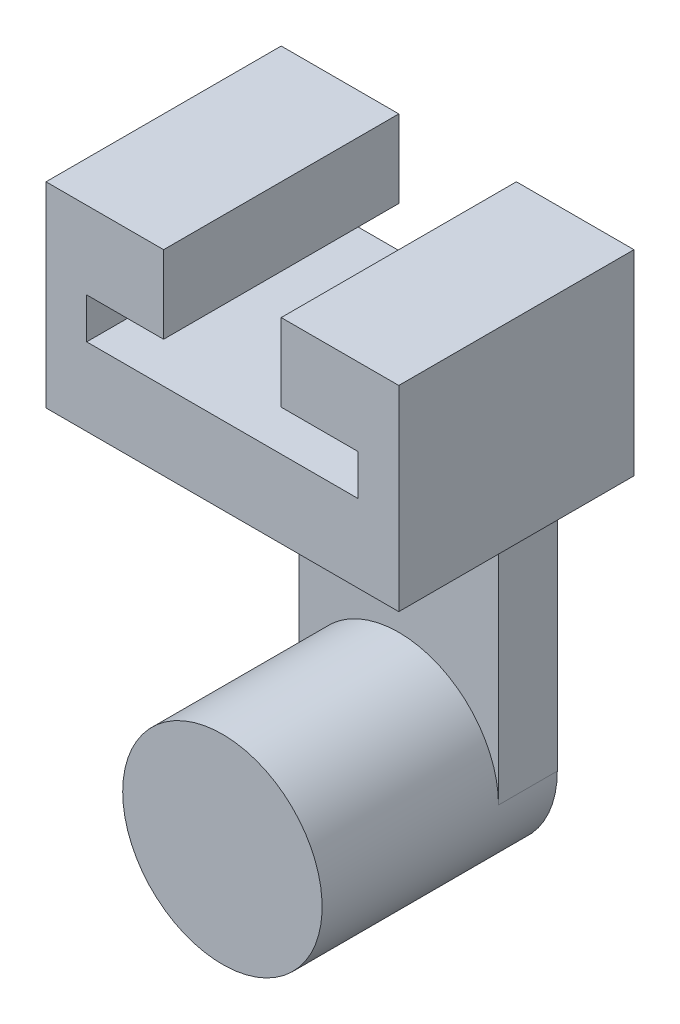
ISO-10303-21;
HEADER;
FILE_DESCRIPTION(('STEP AP214'),'2;1');
FILE_NAME('part.step','',(''),(''),'','','');
FILE_SCHEMA(('AUTOMOTIVE_DESIGN { 1 0 10303 214 1 1 1 1 }'));
ENDSEC;
DATA;
#1=APPLICATION_CONTEXT('core data for automotive mechanical design processes');
#2=APPLICATION_PROTOCOL_DEFINITION('international standard','automotive_design',2000,#1);
#3=PRODUCT_CONTEXT('',#1,'mechanical');
#4=PRODUCT('Part','Part','',(#3));
#5=PRODUCT_RELATED_PRODUCT_CATEGORY('part','',(#4));
#6=PRODUCT_DEFINITION_FORMATION('','',#4);
#7=PRODUCT_DEFINITION_CONTEXT('part definition',#1,'design');
#8=PRODUCT_DEFINITION('design','',#6,#7);
#9=PRODUCT_DEFINITION_SHAPE('','',#8);
#10=(LENGTH_UNIT() NAMED_UNIT(*) SI_UNIT(.MILLI.,.METRE.));
#11=(NAMED_UNIT(*) PLANE_ANGLE_UNIT() SI_UNIT($,.RADIAN.));
#12=(NAMED_UNIT(*) SI_UNIT($,.STERADIAN.) SOLID_ANGLE_UNIT());
#13=UNCERTAINTY_MEASURE_WITH_UNIT(LENGTH_MEASURE(1.E-05),#10,'distance_accuracy_value','');
#14=(GEOMETRIC_REPRESENTATION_CONTEXT(3) GLOBAL_UNCERTAINTY_ASSIGNED_CONTEXT((#13)) GLOBAL_UNIT_ASSIGNED_CONTEXT((#10,
#11,#12)) REPRESENTATION_CONTEXT('',''));
#15=CARTESIAN_POINT('',(0.,0.,0.));
#16=DIRECTION('',(0.,0.,1.));
#17=DIRECTION('',(1.,0.,0.));
#18=AXIS2_PLACEMENT_3D('',#15,#16,#17);
#19=CARTESIAN_POINT('',(-8.28040000000001,0.,6.35));
#20=DIRECTION('',(0.,1.,0.));
#21=DIRECTION('',(0.,0.,1.));
#22=AXIS2_PLACEMENT_3D('',#19,#20,#21);
#23=PLANE('',#22);
#24=DIRECTION('',(1.,0.,0.));
#25=VECTOR('',#24,1.);
#26=CARTESIAN_POINT('',(-8.28040000000001,0.,0.));
#27=LINE('',#26,#25);
#28=CARTESIAN_POINT('',(-29.8196,0.,0.));
#29=VERTEX_POINT('',#28);
#30=CARTESIAN_POINT('',(-8.28040000000001,0.,0.));
#31=VERTEX_POINT('',#30);
#32=EDGE_CURVE('E107',#29,#31,#27,.T.);
#33=ORIENTED_EDGE('',*,*,#32,.F.);
#34=DIRECTION('',(0.,0.,-1.));
#35=VECTOR('',#34,1.);
#36=CARTESIAN_POINT('',(-29.8196,0.,6.35));
#37=LINE('',#36,#35);
#38=CARTESIAN_POINT('',(-29.8196,0.,6.35));
#39=VERTEX_POINT('',#38);
#40=EDGE_CURVE('E12',#39,#29,#37,.T.);
#41=ORIENTED_EDGE('',*,*,#40,.F.);
#42=DIRECTION('',(1.,0.,0.));
#43=VECTOR('',#42,1.);
#44=CARTESIAN_POINT('',(-8.28040000000001,0.,6.35));
#45=LINE('',#44,#43);
#46=CARTESIAN_POINT('',(-8.28040000000001,0.,6.35));
#47=VERTEX_POINT('',#46);
#48=EDGE_CURVE('E97',#39,#47,#45,.T.);
#49=ORIENTED_EDGE('',*,*,#48,.T.);
#50=DIRECTION('',(0.,0.,-1.));
#51=VECTOR('',#50,1.);
#52=CARTESIAN_POINT('',(-8.28040000000001,0.,6.35));
#53=LINE('',#52,#51);
#54=EDGE_CURVE('E51',#47,#31,#53,.T.);
#55=ORIENTED_EDGE('',*,*,#54,.T.);
#56=EDGE_LOOP('',(#33,#41,#49,#55));
#57=FACE_BOUND('',#56,.T.);
#58=ADVANCED_FACE('F48',(#57),#23,.T.);
#59=CARTESIAN_POINT('',(-29.8196,0.,6.35));
#60=DIRECTION('',(-1.,0.,0.));
#61=DIRECTION('',(0.,-1.,0.));
#62=AXIS2_PLACEMENT_3D('',#59,#60,#61);
#63=PLANE('',#62);
#64=DIRECTION('',(0.,1.,0.));
#65=VECTOR('',#64,1.);
#66=CARTESIAN_POINT('',(-29.8196,0.,0.));
#67=LINE('',#66,#65);
#68=CARTESIAN_POINT('',(-29.8196,-31.75,0.));
#69=VERTEX_POINT('',#68);
#70=EDGE_CURVE('E85',#69,#29,#67,.T.);
#71=ORIENTED_EDGE('',*,*,#70,.F.);
#72=DIRECTION('',(0.,0.,-1.));
#73=VECTOR('',#72,1.);
#74=CARTESIAN_POINT('',(-29.8196,-31.75,6.35));
#75=LINE('',#74,#73);
#76=CARTESIAN_POINT('',(-29.8196,-31.75,6.35));
#77=VERTEX_POINT('',#76);
#78=EDGE_CURVE('E60',#77,#69,#75,.T.);
#79=ORIENTED_EDGE('',*,*,#78,.F.);
#80=DIRECTION('',(0.,1.,0.));
#81=VECTOR('',#80,1.);
#82=CARTESIAN_POINT('',(-29.8196,0.,6.35));
#83=LINE('',#82,#81);
#84=EDGE_CURVE('E94',#77,#39,#83,.T.);
#85=ORIENTED_EDGE('',*,*,#84,.T.);
#86=ORIENTED_EDGE('',*,*,#40,.T.);
#87=EDGE_LOOP('',(#71,#79,#85,#86));
#88=FACE_BOUND('',#87,.T.);
#89=ADVANCED_FACE('F99',(#88),#63,.T.);
#90=CARTESIAN_POINT('',(-8.28040000000001,0.,6.35));
#91=DIRECTION('',(1.,0.,0.));
#92=DIRECTION('',(0.,1.,0.));
#93=AXIS2_PLACEMENT_3D('',#90,#91,#92);
#94=PLANE('',#93);
#95=DIRECTION('',(0.,-1.,0.));
#96=VECTOR('',#95,1.);
#97=CARTESIAN_POINT('',(-8.28040000000001,0.,0.));
#98=LINE('',#97,#96);
#99=CARTESIAN_POINT('',(-8.2804,-31.75,0.));
#100=VERTEX_POINT('',#99);
#101=EDGE_CURVE('E113',#31,#100,#98,.T.);
#102=ORIENTED_EDGE('',*,*,#101,.F.);
#103=ORIENTED_EDGE('',*,*,#54,.F.);
#104=DIRECTION('',(0.,-1.,0.));
#105=VECTOR('',#104,1.);
#106=CARTESIAN_POINT('',(-8.28040000000001,0.,6.35));
#107=LINE('',#106,#105);
#108=CARTESIAN_POINT('',(-8.2804,-31.75,6.35));
#109=VERTEX_POINT('',#108);
#110=EDGE_CURVE('E96',#47,#109,#107,.T.);
#111=ORIENTED_EDGE('',*,*,#110,.T.);
#112=DIRECTION('',(0.,0.,-1.));
#113=VECTOR('',#112,1.);
#114=CARTESIAN_POINT('',(-8.2804,-31.75,6.35));
#115=LINE('',#114,#113);
#116=EDGE_CURVE('E104',#109,#100,#115,.T.);
#117=ORIENTED_EDGE('',*,*,#116,.T.);
#118=EDGE_LOOP('',(#102,#103,#111,#117));
#119=FACE_BOUND('',#118,.T.);
#120=ADVANCED_FACE('F121',(#119),#94,.T.);
#121=CARTESIAN_POINT('',(0.,0.,6.35));
#122=DIRECTION('',(0.,0.,1.));
#123=DIRECTION('',(1.,0.,0.));
#124=AXIS2_PLACEMENT_3D('',#121,#122,#123);
#125=PLANE('',#124);
#126=CARTESIAN_POINT('',(-19.05,-31.75,6.35));
#127=DIRECTION('',(0.,0.,1.));
#128=DIRECTION('',(1.,0.,0.));
#129=AXIS2_PLACEMENT_3D('',#126,#127,#128);
#130=CIRCLE('',#129,10.7696);
#131=EDGE_CURVE('E98',#109,#77,#130,.T.);
#132=ORIENTED_EDGE('',*,*,#131,.F.);
#133=ORIENTED_EDGE('',*,*,#110,.F.);
#134=ORIENTED_EDGE('',*,*,#48,.F.);
#135=ORIENTED_EDGE('',*,*,#84,.F.);
#136=EDGE_LOOP('',(#132,#133,#134,#135));
#137=FACE_BOUND('',#136,.T.);
#138=ADVANCED_FACE('F91',(#137),#125,.T.);
#139=CARTESIAN_POINT('',(0.,0.,0.));
#140=DIRECTION('',(0.,0.,1.));
#141=DIRECTION('',(1.,0.,0.));
#142=AXIS2_PLACEMENT_3D('',#139,#140,#141);
#143=PLANE('',#142);
#144=ORIENTED_EDGE('',*,*,#101,.T.);
#145=CARTESIAN_POINT('',(-19.05,-31.75,0.));
#146=DIRECTION('',(0.,0.,-1.));
#147=DIRECTION('',(-1.,0.,0.));
#148=AXIS2_PLACEMENT_3D('',#145,#146,#147);
#149=CIRCLE('',#148,10.7696);
#150=EDGE_CURVE('E116',#100,#69,#149,.T.);
#151=ORIENTED_EDGE('',*,*,#150,.T.);
#152=ORIENTED_EDGE('',*,*,#70,.T.);
#153=ORIENTED_EDGE('',*,*,#32,.T.);
#154=EDGE_LOOP('',(#144,#151,#152,#153));
#155=FACE_BOUND('',#154,.T.);
#156=ADVANCED_FACE('F127',(#155),#143,.F.);
#157=CARTESIAN_POINT('',(-19.05,-31.75,25.4));
#158=DIRECTION('',(0.,0.,-1.));
#159=DIRECTION('',(-1.,0.,0.));
#160=AXIS2_PLACEMENT_3D('',#157,#158,#159);
#161=CYLINDRICAL_SURFACE('',#160,10.7696);
#162=ORIENTED_EDGE('',*,*,#131,.T.);
#163=ORIENTED_EDGE('',*,*,#78,.T.);
#164=ORIENTED_EDGE('',*,*,#150,.F.);
#165=ORIENTED_EDGE('',*,*,#116,.F.);
#166=EDGE_LOOP('',(#162,#163,#164,#165));
#167=FACE_BOUND('',#166,.T.);
#168=CARTESIAN_POINT('',(-19.05,-31.75,25.4));
#169=DIRECTION('',(0.,0.,-1.));
#170=DIRECTION('',(-1.,0.,0.));
#171=AXIS2_PLACEMENT_3D('',#168,#169,#170);
#172=CIRCLE('',#171,10.7696);
#173=CARTESIAN_POINT('',(-29.8196,-31.75,25.4));
#174=VERTEX_POINT('',#173);
#175=EDGE_CURVE('E109',#174,#174,#172,.T.);
#176=ORIENTED_EDGE('',*,*,#175,.T.);
#177=EDGE_LOOP('',(#176));
#178=FACE_BOUND('',#177,.T.);
#179=ADVANCED_FACE('F110',(#167,#178),#161,.T.);
#180=CARTESIAN_POINT('',(-19.05,-31.75,25.4));
#181=DIRECTION('',(0.,0.,-1.));
#182=DIRECTION('',(-1.,0.,0.));
#183=AXIS2_PLACEMENT_3D('',#180,#181,#182);
#184=PLANE('',#183);
#185=ORIENTED_EDGE('',*,*,#175,.F.);
#186=EDGE_LOOP('',(#185));
#187=FACE_BOUND('',#186,.T.);
#188=ADVANCED_FACE('F132',(#187),#184,.F.);
#189=CLOSED_SHELL('',(#58,#89,#120,#138,#156,#179,#188));
#190=MANIFOLD_SOLID_BREP('B2',#189);
#191=CARTESIAN_POINT('',(0.,8.382,25.4));
#192=DIRECTION('',(0.,-1.,0.));
#193=DIRECTION('',(1.,0.,0.));
#194=AXIS2_PLACEMENT_3D('',#191,#192,#193);
#195=PLANE('',#194);
#196=DIRECTION('',(-1.,0.,0.));
#197=VECTOR('',#196,1.);
#198=CARTESIAN_POINT('',(0.,8.382,0.));
#199=LINE('',#198,#197);
#200=CARTESIAN_POINT('',(-4.3942,8.382,0.));
#201=VERTEX_POINT('',#200);
#202=CARTESIAN_POINT('',(-33.7058,8.382,0.));
#203=VERTEX_POINT('',#202);
#204=EDGE_CURVE('E369',#201,#203,#199,.T.);
#205=ORIENTED_EDGE('',*,*,#204,.T.);
#206=DIRECTION('',(0.,0.,1.));
#207=VECTOR('',#206,1.);
#208=CARTESIAN_POINT('',(-33.7058,8.382,0.));
#209=LINE('',#208,#207);
#210=CARTESIAN_POINT('',(-33.7058,8.382,25.4));
#211=VERTEX_POINT('',#210);
#212=EDGE_CURVE('E341',#203,#211,#209,.T.);
#213=ORIENTED_EDGE('',*,*,#212,.T.);
#214=DIRECTION('',(-1.,0.,0.));
#215=VECTOR('',#214,1.);
#216=CARTESIAN_POINT('',(0.,8.382,25.4));
#217=LINE('',#216,#215);
#218=CARTESIAN_POINT('',(-4.3942,8.382,25.4));
#219=VERTEX_POINT('',#218);
#220=EDGE_CURVE('E363',#219,#211,#217,.T.);
#221=ORIENTED_EDGE('',*,*,#220,.F.);
#222=DIRECTION('',(0.,0.,1.));
#223=VECTOR('',#222,1.);
#224=CARTESIAN_POINT('',(-4.3942,8.382,0.));
#225=LINE('',#224,#223);
#226=EDGE_CURVE('E215',#201,#219,#225,.T.);
#227=ORIENTED_EDGE('',*,*,#226,.F.);
#228=EDGE_LOOP('',(#205,#213,#221,#227));
#229=FACE_BOUND('',#228,.T.);
#230=ADVANCED_FACE('F186',(#229),#195,.F.);
#231=CARTESIAN_POINT('',(0.,0.,25.4));
#232=DIRECTION('',(-1.,0.,0.));
#233=DIRECTION('',(0.,0.,1.));
#234=AXIS2_PLACEMENT_3D('',#231,#232,#233);
#235=PLANE('',#234);
#236=DIRECTION('',(0.,1.,0.));
#237=VECTOR('',#236,1.);
#238=CARTESIAN_POINT('',(0.,0.,0.));
#239=LINE('',#238,#237);
#240=CARTESIAN_POINT('',(0.,0.,0.));
#241=VERTEX_POINT('',#240);
#242=CARTESIAN_POINT('',(0.,21.1582,0.));
#243=VERTEX_POINT('',#242);
#244=EDGE_CURVE('E347',#241,#243,#239,.T.);
#245=ORIENTED_EDGE('',*,*,#244,.T.);
#246=DIRECTION('',(0.,0.,1.));
#247=VECTOR('',#246,1.);
#248=CARTESIAN_POINT('',(0.,21.1582,0.));
#249=LINE('',#248,#247);
#250=CARTESIAN_POINT('',(0.,21.1582,25.4));
#251=VERTEX_POINT('',#250);
#252=EDGE_CURVE('E319',#243,#251,#249,.T.);
#253=ORIENTED_EDGE('',*,*,#252,.T.);
#254=DIRECTION('',(0.,1.,0.));
#255=VECTOR('',#254,1.);
#256=CARTESIAN_POINT('',(0.,0.,25.4));
#257=LINE('',#256,#255);
#258=CARTESIAN_POINT('',(0.,0.,25.4));
#259=VERTEX_POINT('',#258);
#260=EDGE_CURVE('E360',#259,#251,#257,.T.);
#261=ORIENTED_EDGE('',*,*,#260,.F.);
#262=DIRECTION('',(0.,0.,-1.));
#263=VECTOR('',#262,1.);
#264=CARTESIAN_POINT('',(0.,0.,25.4));
#265=LINE('',#264,#263);
#266=EDGE_CURVE('E199',#259,#241,#265,.T.);
#267=ORIENTED_EDGE('',*,*,#266,.T.);
#268=EDGE_LOOP('',(#245,#253,#261,#267));
#269=FACE_BOUND('',#268,.T.);
#270=ADVANCED_FACE('F192',(#269),#235,.F.);
#271=CARTESIAN_POINT('',(-38.1,0.,25.4));
#272=DIRECTION('',(1.,0.,0.));
#273=DIRECTION('',(0.,0.,-1.));
#274=AXIS2_PLACEMENT_3D('',#271,#272,#273);
#275=PLANE('',#274);
#276=DIRECTION('',(0.,-1.,0.));
#277=VECTOR('',#276,1.);
#278=CARTESIAN_POINT('',(-38.1,0.,0.));
#279=LINE('',#278,#277);
#280=CARTESIAN_POINT('',(-38.1,21.1582,0.));
#281=VERTEX_POINT('',#280);
#282=CARTESIAN_POINT('',(-38.1,0.,0.));
#283=VERTEX_POINT('',#282);
#284=EDGE_CURVE('E375',#281,#283,#279,.T.);
#285=ORIENTED_EDGE('',*,*,#284,.T.);
#286=DIRECTION('',(0.,0.,-1.));
#287=VECTOR('',#286,1.);
#288=CARTESIAN_POINT('',(-38.1,0.,25.4));
#289=LINE('',#288,#287);
#290=CARTESIAN_POINT('',(-38.1,0.,25.4));
#291=VERTEX_POINT('',#290);
#292=EDGE_CURVE('E46',#291,#283,#289,.T.);
#293=ORIENTED_EDGE('',*,*,#292,.F.);
#294=DIRECTION('',(0.,-1.,0.));
#295=VECTOR('',#294,1.);
#296=CARTESIAN_POINT('',(-38.1,0.,25.4));
#297=LINE('',#296,#295);
#298=CARTESIAN_POINT('',(-38.1,21.1582,25.4));
#299=VERTEX_POINT('',#298);
#300=EDGE_CURVE('E362',#299,#291,#297,.T.);
#301=ORIENTED_EDGE('',*,*,#300,.F.);
#302=DIRECTION('',(0.,0.,1.));
#303=VECTOR('',#302,1.);
#304=CARTESIAN_POINT('',(-38.1,21.1582,0.));
#305=LINE('',#304,#303);
#306=EDGE_CURVE('E313',#281,#299,#305,.T.);
#307=ORIENTED_EDGE('',*,*,#306,.F.);
#308=EDGE_LOOP('',(#285,#293,#301,#307));
#309=FACE_BOUND('',#308,.T.);
#310=ADVANCED_FACE('F391',(#309),#275,.F.);
#311=CARTESIAN_POINT('',(0.,0.,25.4));
#312=DIRECTION('',(0.,1.,0.));
#313=DIRECTION('',(-1.,0.,0.));
#314=AXIS2_PLACEMENT_3D('',#311,#312,#313);
#315=PLANE('',#314);
#316=DIRECTION('',(1.,0.,0.));
#317=VECTOR('',#316,1.);
#318=CARTESIAN_POINT('',(0.,0.,0.));
#319=LINE('',#318,#317);
#320=EDGE_CURVE('E365',#283,#241,#319,.T.);
#321=ORIENTED_EDGE('',*,*,#320,.T.);
#322=ORIENTED_EDGE('',*,*,#266,.F.);
#323=DIRECTION('',(1.,0.,0.));
#324=VECTOR('',#323,1.);
#325=CARTESIAN_POINT('',(0.,0.,25.4));
#326=LINE('',#325,#324);
#327=EDGE_CURVE('E370',#291,#259,#326,.T.);
#328=ORIENTED_EDGE('',*,*,#327,.F.);
#329=ORIENTED_EDGE('',*,*,#292,.T.);
#330=EDGE_LOOP('',(#321,#322,#328,#329));
#331=FACE_BOUND('',#330,.T.);
#332=ADVANCED_FACE('F392',(#331),#315,.F.);
#333=CARTESIAN_POINT('',(0.,0.,25.4));
#334=DIRECTION('',(0.,0.,1.));
#335=DIRECTION('',(1.,0.,0.));
#336=AXIS2_PLACEMENT_3D('',#333,#334,#335);
#337=PLANE('',#336);
#338=ORIENTED_EDGE('',*,*,#260,.T.);
#339=DIRECTION('',(-1.,0.,0.));
#340=VECTOR('',#339,1.);
#341=CARTESIAN_POINT('',(0.,21.1582,25.4));
#342=LINE('',#341,#340);
#343=CARTESIAN_POINT('',(-12.7,21.1582,25.4));
#344=VERTEX_POINT('',#343);
#345=EDGE_CURVE('E309',#251,#344,#342,.T.);
#346=ORIENTED_EDGE('',*,*,#345,.T.);
#347=DIRECTION('',(0.,-1.,0.));
#348=VECTOR('',#347,1.);
#349=CARTESIAN_POINT('',(-12.7,12.7762,25.4));
#350=LINE('',#349,#348);
#351=CARTESIAN_POINT('',(-12.7,12.7762,25.4));
#352=VERTEX_POINT('',#351);
#353=EDGE_CURVE('E330',#344,#352,#350,.T.);
#354=ORIENTED_EDGE('',*,*,#353,.T.);
#355=DIRECTION('',(1.,0.,0.));
#356=VECTOR('',#355,1.);
#357=CARTESIAN_POINT('',(0.,12.7762,25.4));
#358=LINE('',#357,#356);
#359=CARTESIAN_POINT('',(-4.3942,12.7762,25.4));
#360=VERTEX_POINT('',#359);
#361=EDGE_CURVE('E328',#352,#360,#358,.T.);
#362=ORIENTED_EDGE('',*,*,#361,.T.);
#363=DIRECTION('',(0.,-1.,0.));
#364=VECTOR('',#363,1.);
#365=CARTESIAN_POINT('',(-4.3942,8.382,25.4));
#366=LINE('',#365,#364);
#367=EDGE_CURVE('E348',#360,#219,#366,.T.);
#368=ORIENTED_EDGE('',*,*,#367,.T.);
#369=ORIENTED_EDGE('',*,*,#220,.T.);
#370=DIRECTION('',(0.,1.,0.));
#371=VECTOR('',#370,1.);
#372=CARTESIAN_POINT('',(-33.7058,8.382,25.4));
#373=LINE('',#372,#371);
#374=CARTESIAN_POINT('',(-33.7058,12.7762,25.4));
#375=VERTEX_POINT('',#374);
#376=EDGE_CURVE('E201',#211,#375,#373,.T.);
#377=ORIENTED_EDGE('',*,*,#376,.T.);
#378=DIRECTION('',(1.,0.,0.));
#379=VECTOR('',#378,1.);
#380=CARTESIAN_POINT('',(-38.1,12.7762,25.4));
#381=LINE('',#380,#379);
#382=CARTESIAN_POINT('',(-25.4,12.7762,25.4));
#383=VERTEX_POINT('',#382);
#384=EDGE_CURVE('E308',#375,#383,#381,.T.);
#385=ORIENTED_EDGE('',*,*,#384,.T.);
#386=DIRECTION('',(0.,1.,0.));
#387=VECTOR('',#386,1.);
#388=CARTESIAN_POINT('',(-25.4,12.7762,25.4));
#389=LINE('',#388,#387);
#390=CARTESIAN_POINT('',(-25.4,21.1582,25.4));
#391=VERTEX_POINT('',#390);
#392=EDGE_CURVE('E296',#383,#391,#389,.T.);
#393=ORIENTED_EDGE('',*,*,#392,.T.);
#394=DIRECTION('',(-1.,0.,0.));
#395=VECTOR('',#394,1.);
#396=CARTESIAN_POINT('',(-38.1,21.1582,25.4));
#397=LINE('',#396,#395);
#398=EDGE_CURVE('E293',#391,#299,#397,.T.);
#399=ORIENTED_EDGE('',*,*,#398,.T.);
#400=ORIENTED_EDGE('',*,*,#300,.T.);
#401=ORIENTED_EDGE('',*,*,#327,.T.);
#402=EDGE_LOOP('',(#338,#346,#354,#362,#368,#369,#377,#385,#393,#399,#400,#401));
#403=FACE_BOUND('',#402,.T.);
#404=ADVANCED_FACE('F388',(#403),#337,.T.);
#405=CARTESIAN_POINT('',(0.,0.,0.));
#406=DIRECTION('',(0.,0.,1.));
#407=DIRECTION('',(1.,0.,0.));
#408=AXIS2_PLACEMENT_3D('',#405,#406,#407);
#409=PLANE('',#408);
#410=ORIENTED_EDGE('',*,*,#244,.F.);
#411=ORIENTED_EDGE('',*,*,#320,.F.);
#412=ORIENTED_EDGE('',*,*,#284,.F.);
#413=DIRECTION('',(-1.,0.,0.));
#414=VECTOR('',#413,1.);
#415=CARTESIAN_POINT('',(-38.1,21.1582,0.));
#416=LINE('',#415,#414);
#417=CARTESIAN_POINT('',(-25.4,21.1582,0.));
#418=VERTEX_POINT('',#417);
#419=EDGE_CURVE('E297',#418,#281,#416,.T.);
#420=ORIENTED_EDGE('',*,*,#419,.F.);
#421=DIRECTION('',(0.,1.,0.));
#422=VECTOR('',#421,1.);
#423=CARTESIAN_POINT('',(-25.4,12.7762,0.));
#424=LINE('',#423,#422);
#425=CARTESIAN_POINT('',(-25.4,12.7762,0.));
#426=VERTEX_POINT('',#425);
#427=EDGE_CURVE('E288',#426,#418,#424,.T.);
#428=ORIENTED_EDGE('',*,*,#427,.F.);
#429=DIRECTION('',(1.,0.,0.));
#430=VECTOR('',#429,1.);
#431=CARTESIAN_POINT('',(-38.1,12.7762,0.));
#432=LINE('',#431,#430);
#433=CARTESIAN_POINT('',(-33.7058,12.7762,0.));
#434=VERTEX_POINT('',#433);
#435=EDGE_CURVE('E278',#434,#426,#432,.T.);
#436=ORIENTED_EDGE('',*,*,#435,.F.);
#437=DIRECTION('',(0.,1.,0.));
#438=VECTOR('',#437,1.);
#439=CARTESIAN_POINT('',(-33.7058,8.382,0.));
#440=LINE('',#439,#438);
#441=EDGE_CURVE('E345',#203,#434,#440,.T.);
#442=ORIENTED_EDGE('',*,*,#441,.F.);
#443=ORIENTED_EDGE('',*,*,#204,.F.);
#444=DIRECTION('',(0.,-1.,0.));
#445=VECTOR('',#444,1.);
#446=CARTESIAN_POINT('',(-4.3942,8.382,0.));
#447=LINE('',#446,#445);
#448=CARTESIAN_POINT('',(-4.3942,12.7762,0.));
#449=VERTEX_POINT('',#448);
#450=EDGE_CURVE('E354',#449,#201,#447,.T.);
#451=ORIENTED_EDGE('',*,*,#450,.F.);
#452=DIRECTION('',(1.,0.,0.));
#453=VECTOR('',#452,1.);
#454=CARTESIAN_POINT('',(0.,12.7762,0.));
#455=LINE('',#454,#453);
#456=CARTESIAN_POINT('',(-12.7,12.7762,0.));
#457=VERTEX_POINT('',#456);
#458=EDGE_CURVE('E322',#457,#449,#455,.T.);
#459=ORIENTED_EDGE('',*,*,#458,.F.);
#460=DIRECTION('',(0.,-1.,0.));
#461=VECTOR('',#460,1.);
#462=CARTESIAN_POINT('',(-12.7,12.7762,0.));
#463=LINE('',#462,#461);
#464=CARTESIAN_POINT('',(-12.7,21.1582,0.));
#465=VERTEX_POINT('',#464);
#466=EDGE_CURVE('E340',#465,#457,#463,.T.);
#467=ORIENTED_EDGE('',*,*,#466,.F.);
#468=DIRECTION('',(-1.,0.,0.));
#469=VECTOR('',#468,1.);
#470=CARTESIAN_POINT('',(0.,21.1582,0.));
#471=LINE('',#470,#469);
#472=EDGE_CURVE('E326',#243,#465,#471,.T.);
#473=ORIENTED_EDGE('',*,*,#472,.F.);
#474=EDGE_LOOP('',(#410,#411,#412,#420,#428,#436,#442,#443,#451,#459,#467,#473));
#475=FACE_BOUND('',#474,.T.);
#476=ADVANCED_FACE('F303',(#475),#409,.F.);
#477=CARTESIAN_POINT('',(-4.3942,8.382,0.));
#478=DIRECTION('',(-1.,0.,0.));
#479=DIRECTION('',(0.,0.,1.));
#480=AXIS2_PLACEMENT_3D('',#477,#478,#479);
#481=PLANE('',#480);
#482=ORIENTED_EDGE('',*,*,#367,.F.);
#483=DIRECTION('',(0.,0.,1.));
#484=VECTOR('',#483,1.);
#485=CARTESIAN_POINT('',(-4.3942,12.7762,0.));
#486=LINE('',#485,#484);
#487=EDGE_CURVE('E346',#449,#360,#486,.T.);
#488=ORIENTED_EDGE('',*,*,#487,.F.);
#489=ORIENTED_EDGE('',*,*,#450,.T.);
#490=ORIENTED_EDGE('',*,*,#226,.T.);
#491=EDGE_LOOP('',(#482,#488,#489,#490));
#492=FACE_BOUND('',#491,.T.);
#493=ADVANCED_FACE('F401',(#492),#481,.T.);
#494=CARTESIAN_POINT('',(-33.7058,8.382,0.));
#495=DIRECTION('',(1.,0.,0.));
#496=DIRECTION('',(0.,0.,-1.));
#497=AXIS2_PLACEMENT_3D('',#494,#495,#496);
#498=PLANE('',#497);
#499=ORIENTED_EDGE('',*,*,#376,.F.);
#500=ORIENTED_EDGE('',*,*,#212,.F.);
#501=ORIENTED_EDGE('',*,*,#441,.T.);
#502=DIRECTION('',(0.,0.,1.));
#503=VECTOR('',#502,1.);
#504=CARTESIAN_POINT('',(-33.7058,12.7762,0.));
#505=LINE('',#504,#503);
#506=EDGE_CURVE('E281',#434,#375,#505,.T.);
#507=ORIENTED_EDGE('',*,*,#506,.T.);
#508=EDGE_LOOP('',(#499,#500,#501,#507));
#509=FACE_BOUND('',#508,.T.);
#510=ADVANCED_FACE('F398',(#509),#498,.T.);
#511=CARTESIAN_POINT('',(-38.1,12.7762,0.));
#512=DIRECTION('',(0.,-1.,0.));
#513=DIRECTION('',(0.,0.,-1.));
#514=AXIS2_PLACEMENT_3D('',#511,#512,#513);
#515=PLANE('',#514);
#516=ORIENTED_EDGE('',*,*,#506,.F.);
#517=ORIENTED_EDGE('',*,*,#435,.T.);
#518=DIRECTION('',(0.,0.,1.));
#519=VECTOR('',#518,1.);
#520=CARTESIAN_POINT('',(-25.4,12.7762,0.));
#521=LINE('',#520,#519);
#522=EDGE_CURVE('E282',#426,#383,#521,.T.);
#523=ORIENTED_EDGE('',*,*,#522,.T.);
#524=ORIENTED_EDGE('',*,*,#384,.F.);
#525=EDGE_LOOP('',(#516,#517,#523,#524));
#526=FACE_BOUND('',#525,.T.);
#527=ADVANCED_FACE('F284',(#526),#515,.T.);
#528=CARTESIAN_POINT('',(-38.1,21.1582,0.));
#529=DIRECTION('',(0.,1.,0.));
#530=DIRECTION('',(0.,0.,1.));
#531=AXIS2_PLACEMENT_3D('',#528,#529,#530);
#532=PLANE('',#531);
#533=ORIENTED_EDGE('',*,*,#398,.F.);
#534=DIRECTION('',(0.,0.,1.));
#535=VECTOR('',#534,1.);
#536=CARTESIAN_POINT('',(-25.4,21.1582,0.));
#537=LINE('',#536,#535);
#538=EDGE_CURVE('E299',#418,#391,#537,.T.);
#539=ORIENTED_EDGE('',*,*,#538,.F.);
#540=ORIENTED_EDGE('',*,*,#419,.T.);
#541=ORIENTED_EDGE('',*,*,#306,.T.);
#542=EDGE_LOOP('',(#533,#539,#540,#541));
#543=FACE_BOUND('',#542,.T.);
#544=ADVANCED_FACE('F396',(#543),#532,.T.);
#545=CARTESIAN_POINT('',(-25.4,12.7762,0.));
#546=DIRECTION('',(1.,0.,0.));
#547=DIRECTION('',(0.,0.,-1.));
#548=AXIS2_PLACEMENT_3D('',#545,#546,#547);
#549=PLANE('',#548);
#550=ORIENTED_EDGE('',*,*,#392,.F.);
#551=ORIENTED_EDGE('',*,*,#522,.F.);
#552=ORIENTED_EDGE('',*,*,#427,.T.);
#553=ORIENTED_EDGE('',*,*,#538,.T.);
#554=EDGE_LOOP('',(#550,#551,#552,#553));
#555=FACE_BOUND('',#554,.T.);
#556=ADVANCED_FACE('F294',(#555),#549,.T.);
#557=CARTESIAN_POINT('',(0.,12.7762,0.));
#558=DIRECTION('',(0.,-1.,0.));
#559=DIRECTION('',(1.,0.,0.));
#560=AXIS2_PLACEMENT_3D('',#557,#558,#559);
#561=PLANE('',#560);
#562=ORIENTED_EDGE('',*,*,#458,.T.);
#563=ORIENTED_EDGE('',*,*,#487,.T.);
#564=ORIENTED_EDGE('',*,*,#361,.F.);
#565=DIRECTION('',(0.,0.,1.));
#566=VECTOR('',#565,1.);
#567=CARTESIAN_POINT('',(-12.7,12.7762,0.));
#568=LINE('',#567,#566);
#569=EDGE_CURVE('E321',#457,#352,#568,.T.);
#570=ORIENTED_EDGE('',*,*,#569,.F.);
#571=EDGE_LOOP('',(#562,#563,#564,#570));
#572=FACE_BOUND('',#571,.T.);
#573=ADVANCED_FACE('F403',(#572),#561,.T.);
#574=CARTESIAN_POINT('',(-12.7,12.7762,0.));
#575=DIRECTION('',(-1.,0.,0.));
#576=DIRECTION('',(0.,-1.,0.));
#577=AXIS2_PLACEMENT_3D('',#574,#575,#576);
#578=PLANE('',#577);
#579=ORIENTED_EDGE('',*,*,#353,.F.);
#580=DIRECTION('',(0.,0.,1.));
#581=VECTOR('',#580,1.);
#582=CARTESIAN_POINT('',(-12.7,21.1582,0.));
#583=LINE('',#582,#581);
#584=EDGE_CURVE('E325',#465,#344,#583,.T.);
#585=ORIENTED_EDGE('',*,*,#584,.F.);
#586=ORIENTED_EDGE('',*,*,#466,.T.);
#587=ORIENTED_EDGE('',*,*,#569,.T.);
#588=EDGE_LOOP('',(#579,#585,#586,#587));
#589=FACE_BOUND('',#588,.T.);
#590=ADVANCED_FACE('F410',(#589),#578,.T.);
#591=CARTESIAN_POINT('',(0.,21.1582,0.));
#592=DIRECTION('',(0.,1.,0.));
#593=DIRECTION('',(0.,0.,1.));
#594=AXIS2_PLACEMENT_3D('',#591,#592,#593);
#595=PLANE('',#594);
#596=ORIENTED_EDGE('',*,*,#345,.F.);
#597=ORIENTED_EDGE('',*,*,#252,.F.);
#598=ORIENTED_EDGE('',*,*,#472,.T.);
#599=ORIENTED_EDGE('',*,*,#584,.T.);
#600=EDGE_LOOP('',(#596,#597,#598,#599));
#601=FACE_BOUND('',#600,.T.);
#602=ADVANCED_FACE('F390',(#601),#595,.T.);
#603=CLOSED_SHELL('',(#230,#270,#310,#332,#404,#476,#493,#510,#527,#544,#556,#573,#590,#602));
#604=MANIFOLD_SOLID_BREP('B6',#603);
#605=ADVANCED_BREP_SHAPE_REPRESENTATION('',(#18,#190,#604),#14);
#606=SHAPE_DEFINITION_REPRESENTATION(#9,#605);
ENDSEC;
END-ISO-10303-21;
